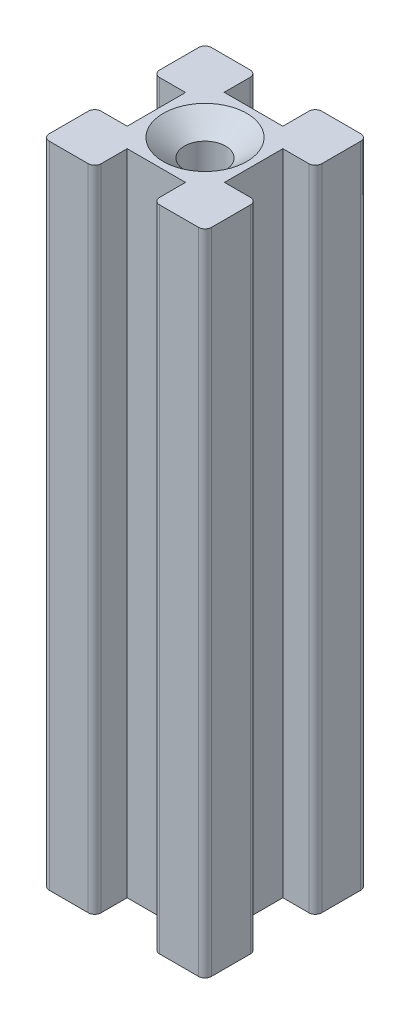
ISO-10303-21;
HEADER;
FILE_DESCRIPTION(('STEP AP214'),'2;1');
FILE_NAME('part.step','',(''),(''),'','','');
FILE_SCHEMA(('AUTOMOTIVE_DESIGN { 1 0 10303 214 1 1 1 1 }'));
ENDSEC;
DATA;
#1=APPLICATION_CONTEXT('core data for automotive mechanical design processes');
#2=APPLICATION_PROTOCOL_DEFINITION('international standard','automotive_design',2000,#1);
#3=PRODUCT_CONTEXT('',#1,'mechanical');
#4=PRODUCT('Part','Part','',(#3));
#5=PRODUCT_RELATED_PRODUCT_CATEGORY('part','',(#4));
#6=PRODUCT_DEFINITION_FORMATION('','',#4);
#7=PRODUCT_DEFINITION_CONTEXT('part definition',#1,'design');
#8=PRODUCT_DEFINITION('design','',#6,#7);
#9=PRODUCT_DEFINITION_SHAPE('','',#8);
#10=(LENGTH_UNIT() NAMED_UNIT(*) SI_UNIT(.MILLI.,.METRE.));
#11=(NAMED_UNIT(*) PLANE_ANGLE_UNIT() SI_UNIT($,.RADIAN.));
#12=(NAMED_UNIT(*) SI_UNIT($,.STERADIAN.) SOLID_ANGLE_UNIT());
#13=UNCERTAINTY_MEASURE_WITH_UNIT(LENGTH_MEASURE(1.E-05),#10,'distance_accuracy_value','');
#14=(GEOMETRIC_REPRESENTATION_CONTEXT(3) GLOBAL_UNCERTAINTY_ASSIGNED_CONTEXT((#13)) GLOBAL_UNIT_ASSIGNED_CONTEXT((#10,
#11,#12)) REPRESENTATION_CONTEXT('',''));
#15=CARTESIAN_POINT('',(0.,0.,0.));
#16=DIRECTION('',(0.,0.,1.));
#17=DIRECTION('',(1.,0.,0.));
#18=AXIS2_PLACEMENT_3D('',#15,#16,#17);
#19=CARTESIAN_POINT('',(0.,100.,0.));
#20=DIRECTION('',(0.,-1.,0.));
#21=DIRECTION('',(0.,0.,-1.));
#22=AXIS2_PLACEMENT_3D('',#19,#20,#21);
#23=PLANE('',#22);
#24=DIRECTION('',(-1.,0.,0.));
#25=VECTOR('',#24,1.);
#26=CARTESIAN_POINT('',(-12.5,100.,-12.5));
#27=LINE('',#26,#25);
#28=CARTESIAN_POINT('',(11.5,100.,-12.5));
#29=VERTEX_POINT('',#28);
#30=CARTESIAN_POINT('',(5.5,100.,-12.5));
#31=VERTEX_POINT('',#30);
#32=EDGE_CURVE('E349',#29,#31,#27,.T.);
#33=ORIENTED_EDGE('',*,*,#32,.T.);
#34=CARTESIAN_POINT('',(5.5,100.,-11.5));
#35=DIRECTION('',(0.,-1.,0.));
#36=DIRECTION('',(0.,0.,-1.));
#37=AXIS2_PLACEMENT_3D('',#34,#35,#36);
#38=CIRCLE('',#37,1.);
#39=CARTESIAN_POINT('',(4.5,100.,-11.5));
#40=VERTEX_POINT('',#39);
#41=EDGE_CURVE('E399',#31,#40,#38,.F.);
#42=ORIENTED_EDGE('',*,*,#41,.T.);
#43=DIRECTION('',(0.,0.,-1.));
#44=VECTOR('',#43,1.);
#45=CARTESIAN_POINT('',(4.5,100.,-12.5));
#46=LINE('',#45,#44);
#47=CARTESIAN_POINT('',(4.5,100.,-7.5));
#48=VERTEX_POINT('',#47);
#49=EDGE_CURVE('E282',#48,#40,#46,.T.);
#50=ORIENTED_EDGE('',*,*,#49,.F.);
#51=DIRECTION('',(1.,0.,0.));
#52=VECTOR('',#51,1.);
#53=CARTESIAN_POINT('',(-4.54888839386136,100.,-7.5));
#54=LINE('',#53,#52);
#55=CARTESIAN_POINT('',(-4.54888839386136,100.,-7.5));
#56=VERTEX_POINT('',#55);
#57=EDGE_CURVE('E290',#56,#48,#54,.T.);
#58=ORIENTED_EDGE('',*,*,#57,.F.);
#59=DIRECTION('',(0.,0.,1.));
#60=VECTOR('',#59,1.);
#61=CARTESIAN_POINT('',(-4.54888839386136,100.,-12.5));
#62=LINE('',#61,#60);
#63=CARTESIAN_POINT('',(-4.54888839386136,100.,-11.5));
#64=VERTEX_POINT('',#63);
#65=EDGE_CURVE('E288',#64,#56,#62,.T.);
#66=ORIENTED_EDGE('',*,*,#65,.F.);
#67=CARTESIAN_POINT('',(-5.54888839386136,100.,-11.5));
#68=DIRECTION('',(0.,-1.,0.));
#69=DIRECTION('',(0.,0.,-1.));
#70=AXIS2_PLACEMENT_3D('',#67,#68,#69);
#71=CIRCLE('',#70,1.);
#72=CARTESIAN_POINT('',(-5.54888839386136,100.,-12.5));
#73=VERTEX_POINT('',#72);
#74=EDGE_CURVE('E377',#64,#73,#71,.F.);
#75=ORIENTED_EDGE('',*,*,#74,.T.);
#76=CARTESIAN_POINT('',(-11.5,100.,-12.5));
#77=VERTEX_POINT('',#76);
#78=EDGE_CURVE('E346',#73,#77,#27,.T.);
#79=ORIENTED_EDGE('',*,*,#78,.T.);
#80=CARTESIAN_POINT('',(-11.5,100.,-11.5));
#81=DIRECTION('',(0.,-1.,0.));
#82=DIRECTION('',(0.,0.,-1.));
#83=AXIS2_PLACEMENT_3D('',#80,#81,#82);
#84=CIRCLE('',#83,1.);
#85=CARTESIAN_POINT('',(-12.5,100.,-11.5));
#86=VERTEX_POINT('',#85);
#87=EDGE_CURVE('E379',#77,#86,#84,.F.);
#88=ORIENTED_EDGE('',*,*,#87,.T.);
#89=DIRECTION('',(0.,0.,1.));
#90=VECTOR('',#89,1.);
#91=CARTESIAN_POINT('',(-12.5,100.,12.5));
#92=LINE('',#91,#90);
#93=CARTESIAN_POINT('',(-12.5,100.,-5.5));
#94=VERTEX_POINT('',#93);
#95=EDGE_CURVE('E353',#86,#94,#92,.T.);
#96=ORIENTED_EDGE('',*,*,#95,.T.);
#97=CARTESIAN_POINT('',(-11.5,100.,-5.5));
#98=DIRECTION('',(0.,-1.,0.));
#99=DIRECTION('',(0.,0.,-1.));
#100=AXIS2_PLACEMENT_3D('',#97,#98,#99);
#101=CIRCLE('',#100,1.);
#102=CARTESIAN_POINT('',(-11.5,100.,-4.5));
#103=VERTEX_POINT('',#102);
#104=EDGE_CURVE('E381',#94,#103,#101,.F.);
#105=ORIENTED_EDGE('',*,*,#104,.T.);
#106=DIRECTION('',(-1.,0.,0.));
#107=VECTOR('',#106,1.);
#108=CARTESIAN_POINT('',(-12.5,100.,-4.5));
#109=LINE('',#108,#107);
#110=CARTESIAN_POINT('',(-7.5,100.,-4.5));
#111=VERTEX_POINT('',#110);
#112=EDGE_CURVE('E269',#111,#103,#109,.T.);
#113=ORIENTED_EDGE('',*,*,#112,.F.);
#114=DIRECTION('',(0.,0.,-1.));
#115=VECTOR('',#114,1.);
#116=CARTESIAN_POINT('',(-7.5,100.,4.5));
#117=LINE('',#116,#115);
#118=CARTESIAN_POINT('',(-7.5,100.,4.5));
#119=VERTEX_POINT('',#118);
#120=EDGE_CURVE('E251',#119,#111,#117,.T.);
#121=ORIENTED_EDGE('',*,*,#120,.F.);
#122=DIRECTION('',(1.,0.,0.));
#123=VECTOR('',#122,1.);
#124=CARTESIAN_POINT('',(-12.5,100.,4.5));
#125=LINE('',#124,#123);
#126=CARTESIAN_POINT('',(-11.5,100.,4.5));
#127=VERTEX_POINT('',#126);
#128=EDGE_CURVE('E273',#127,#119,#125,.T.);
#129=ORIENTED_EDGE('',*,*,#128,.F.);
#130=CARTESIAN_POINT('',(-11.5,100.,5.5));
#131=DIRECTION('',(0.,-1.,0.));
#132=DIRECTION('',(0.,0.,-1.));
#133=AXIS2_PLACEMENT_3D('',#130,#131,#132);
#134=CIRCLE('',#133,1.);
#135=CARTESIAN_POINT('',(-12.5,100.,5.5));
#136=VERTEX_POINT('',#135);
#137=EDGE_CURVE('E383',#127,#136,#134,.F.);
#138=ORIENTED_EDGE('',*,*,#137,.T.);
#139=CARTESIAN_POINT('',(-12.5,100.,11.5));
#140=VERTEX_POINT('',#139);
#141=EDGE_CURVE('E350',#136,#140,#92,.T.);
#142=ORIENTED_EDGE('',*,*,#141,.T.);
#143=CARTESIAN_POINT('',(-11.5,100.,11.5));
#144=DIRECTION('',(0.,-1.,0.));
#145=DIRECTION('',(0.,0.,-1.));
#146=AXIS2_PLACEMENT_3D('',#143,#144,#145);
#147=CIRCLE('',#146,1.);
#148=CARTESIAN_POINT('',(-11.5,100.,12.5));
#149=VERTEX_POINT('',#148);
#150=EDGE_CURVE('E385',#140,#149,#147,.F.);
#151=ORIENTED_EDGE('',*,*,#150,.T.);
#152=DIRECTION('',(1.,0.,0.));
#153=VECTOR('',#152,1.);
#154=CARTESIAN_POINT('',(-12.5,100.,12.5));
#155=LINE('',#154,#153);
#156=CARTESIAN_POINT('',(-5.5,100.,12.5));
#157=VERTEX_POINT('',#156);
#158=EDGE_CURVE('E357',#149,#157,#155,.T.);
#159=ORIENTED_EDGE('',*,*,#158,.T.);
#160=CARTESIAN_POINT('',(-5.5,100.,11.5));
#161=DIRECTION('',(0.,-1.,0.));
#162=DIRECTION('',(0.,0.,-1.));
#163=AXIS2_PLACEMENT_3D('',#160,#161,#162);
#164=CIRCLE('',#163,1.);
#165=CARTESIAN_POINT('',(-4.5,100.,11.5));
#166=VERTEX_POINT('',#165);
#167=EDGE_CURVE('E387',#157,#166,#164,.F.);
#168=ORIENTED_EDGE('',*,*,#167,.T.);
#169=DIRECTION('',(0.,0.,1.));
#170=VECTOR('',#169,1.);
#171=CARTESIAN_POINT('',(-4.5,100.,12.5));
#172=LINE('',#171,#170);
#173=CARTESIAN_POINT('',(-4.5,100.,7.5));
#174=VERTEX_POINT('',#173);
#175=EDGE_CURVE('E309',#174,#166,#172,.T.);
#176=ORIENTED_EDGE('',*,*,#175,.F.);
#177=DIRECTION('',(-1.,0.,0.));
#178=VECTOR('',#177,1.);
#179=CARTESIAN_POINT('',(-4.5,100.,7.5));
#180=LINE('',#179,#178);
#181=CARTESIAN_POINT('',(4.5,100.,7.5));
#182=VERTEX_POINT('',#181);
#183=EDGE_CURVE('E303',#182,#174,#180,.T.);
#184=ORIENTED_EDGE('',*,*,#183,.F.);
#185=DIRECTION('',(0.,0.,-1.));
#186=VECTOR('',#185,1.);
#187=CARTESIAN_POINT('',(4.5,100.,12.5));
#188=LINE('',#187,#186);
#189=CARTESIAN_POINT('',(4.5,100.,11.5));
#190=VERTEX_POINT('',#189);
#191=EDGE_CURVE('E312',#190,#182,#188,.T.);
#192=ORIENTED_EDGE('',*,*,#191,.F.);
#193=CARTESIAN_POINT('',(5.5,100.,11.5));
#194=DIRECTION('',(0.,-1.,0.));
#195=DIRECTION('',(0.,0.,-1.));
#196=AXIS2_PLACEMENT_3D('',#193,#194,#195);
#197=CIRCLE('',#196,1.);
#198=CARTESIAN_POINT('',(5.5,100.,12.5));
#199=VERTEX_POINT('',#198);
#200=EDGE_CURVE('E389',#190,#199,#197,.F.);
#201=ORIENTED_EDGE('',*,*,#200,.T.);
#202=CARTESIAN_POINT('',(11.5,100.,12.5));
#203=VERTEX_POINT('',#202);
#204=EDGE_CURVE('E354',#199,#203,#155,.T.);
#205=ORIENTED_EDGE('',*,*,#204,.T.);
#206=CARTESIAN_POINT('',(11.5,100.,11.5));
#207=DIRECTION('',(0.,-1.,0.));
#208=DIRECTION('',(0.,0.,-1.));
#209=AXIS2_PLACEMENT_3D('',#206,#207,#208);
#210=CIRCLE('',#209,1.);
#211=CARTESIAN_POINT('',(12.5,100.,11.5));
#212=VERTEX_POINT('',#211);
#213=EDGE_CURVE('E391',#203,#212,#210,.F.);
#214=ORIENTED_EDGE('',*,*,#213,.T.);
#215=DIRECTION('',(0.,0.,-1.));
#216=VECTOR('',#215,1.);
#217=CARTESIAN_POINT('',(12.5,100.,12.5));
#218=LINE('',#217,#216);
#219=CARTESIAN_POINT('',(12.5,100.,5.5));
#220=VERTEX_POINT('',#219);
#221=EDGE_CURVE('E344',#212,#220,#218,.T.);
#222=ORIENTED_EDGE('',*,*,#221,.T.);
#223=CARTESIAN_POINT('',(11.5,100.,5.5));
#224=DIRECTION('',(0.,-1.,0.));
#225=DIRECTION('',(0.,0.,-1.));
#226=AXIS2_PLACEMENT_3D('',#223,#224,#225);
#227=CIRCLE('',#226,1.);
#228=CARTESIAN_POINT('',(11.5,100.,4.5));
#229=VERTEX_POINT('',#228);
#230=EDGE_CURVE('E393',#220,#229,#227,.F.);
#231=ORIENTED_EDGE('',*,*,#230,.T.);
#232=DIRECTION('',(1.,0.,0.));
#233=VECTOR('',#232,1.);
#234=CARTESIAN_POINT('',(12.5,100.,4.5));
#235=LINE('',#234,#233);
#236=CARTESIAN_POINT('',(7.5,100.,4.5));
#237=VERTEX_POINT('',#236);
#238=EDGE_CURVE('E323',#237,#229,#235,.T.);
#239=ORIENTED_EDGE('',*,*,#238,.F.);
#240=DIRECTION('',(0.,0.,1.));
#241=VECTOR('',#240,1.);
#242=CARTESIAN_POINT('',(7.5,100.,-4.5));
#243=LINE('',#242,#241);
#244=CARTESIAN_POINT('',(7.5,100.,-4.5));
#245=VERTEX_POINT('',#244);
#246=EDGE_CURVE('E332',#245,#237,#243,.T.);
#247=ORIENTED_EDGE('',*,*,#246,.F.);
#248=DIRECTION('',(-1.,0.,0.));
#249=VECTOR('',#248,1.);
#250=CARTESIAN_POINT('',(12.5,100.,-4.5));
#251=LINE('',#250,#249);
#252=CARTESIAN_POINT('',(11.5,100.,-4.5));
#253=VERTEX_POINT('',#252);
#254=EDGE_CURVE('E330',#253,#245,#251,.T.);
#255=ORIENTED_EDGE('',*,*,#254,.F.);
#256=CARTESIAN_POINT('',(11.5,100.,-5.5));
#257=DIRECTION('',(0.,-1.,0.));
#258=DIRECTION('',(0.,0.,-1.));
#259=AXIS2_PLACEMENT_3D('',#256,#257,#258);
#260=CIRCLE('',#259,1.);
#261=CARTESIAN_POINT('',(12.5,100.,-5.5));
#262=VERTEX_POINT('',#261);
#263=EDGE_CURVE('E395',#253,#262,#260,.F.);
#264=ORIENTED_EDGE('',*,*,#263,.T.);
#265=CARTESIAN_POINT('',(12.5,100.,-11.5));
#266=VERTEX_POINT('',#265);
#267=EDGE_CURVE('E341',#262,#266,#218,.T.);
#268=ORIENTED_EDGE('',*,*,#267,.T.);
#269=CARTESIAN_POINT('',(11.5,100.,-11.5));
#270=DIRECTION('',(0.,-1.,0.));
#271=DIRECTION('',(0.,0.,-1.));
#272=AXIS2_PLACEMENT_3D('',#269,#270,#271);
#273=CIRCLE('',#272,1.);
#274=EDGE_CURVE('E397',#266,#29,#273,.F.);
#275=ORIENTED_EDGE('',*,*,#274,.T.);
#276=EDGE_LOOP('',(#33,#42,#50,#58,#66,#75,#79,#88,#96,#105,#113,#121,#129,#138,#142,#151,#159,
#168,#176,#184,#192,#201,#205,#214,#222,#231,#239,#247,#255,#264,#268,#275));
#277=FACE_BOUND('',#276,.T.);
#278=CARTESIAN_POINT('',(0.,100.,0.));
#279=DIRECTION('',(0.,1.,0.));
#280=DIRECTION('',(0.,0.,1.));
#281=AXIS2_PLACEMENT_3D('',#278,#279,#280);
#282=CIRCLE('',#281,6.4389);
#283=CARTESIAN_POINT('',(0.,100.,6.4389));
#284=VERTEX_POINT('',#283);
#285=EDGE_CURVE('E895',#284,#284,#282,.T.);
#286=ORIENTED_EDGE('',*,*,#285,.F.);
#287=EDGE_LOOP('',(#286));
#288=FACE_BOUND('',#287,.T.);
#289=ADVANCED_FACE('F34',(#277,#288),#23,.F.);
#290=CARTESIAN_POINT('',(12.5,100.,12.5));
#291=DIRECTION('',(-1.,0.,0.));
#292=DIRECTION('',(0.,0.,1.));
#293=AXIS2_PLACEMENT_3D('',#290,#291,#292);
#294=PLANE('',#293);
#295=DIRECTION('',(0.,0.,-1.));
#296=VECTOR('',#295,1.);
#297=CARTESIAN_POINT('',(12.5,0.,12.5));
#298=LINE('',#297,#296);
#299=CARTESIAN_POINT('',(12.5,0.,11.5));
#300=VERTEX_POINT('',#299);
#301=CARTESIAN_POINT('',(12.5,0.,5.5));
#302=VERTEX_POINT('',#301);
#303=EDGE_CURVE('E358',#300,#302,#298,.T.);
#304=ORIENTED_EDGE('',*,*,#303,.T.);
#305=DIRECTION('',(0.,1.,0.));
#306=VECTOR('',#305,1.);
#307=CARTESIAN_POINT('',(12.5,100.,5.5));
#308=LINE('',#307,#306);
#309=EDGE_CURVE('E435',#302,#220,#308,.T.);
#310=ORIENTED_EDGE('',*,*,#309,.T.);
#311=ORIENTED_EDGE('',*,*,#221,.F.);
#312=DIRECTION('',(0.,-1.,0.));
#313=VECTOR('',#312,1.);
#314=CARTESIAN_POINT('',(12.5,100.,11.5));
#315=LINE('',#314,#313);
#316=EDGE_CURVE('E432',#212,#300,#315,.T.);
#317=ORIENTED_EDGE('',*,*,#316,.T.);
#318=EDGE_LOOP('',(#304,#310,#311,#317));
#319=FACE_BOUND('',#318,.T.);
#320=ADVANCED_FACE('F506',(#319),#294,.F.);
#321=CARTESIAN_POINT('',(-12.5,100.,-12.5));
#322=DIRECTION('',(0.,0.,1.));
#323=DIRECTION('',(1.,0.,0.));
#324=AXIS2_PLACEMENT_3D('',#321,#322,#323);
#325=PLANE('',#324);
#326=DIRECTION('',(-1.,0.,0.));
#327=VECTOR('',#326,1.);
#328=CARTESIAN_POINT('',(-12.5,0.,-12.5));
#329=LINE('',#328,#327);
#330=CARTESIAN_POINT('',(-5.54888839386136,0.,-12.5));
#331=VERTEX_POINT('',#330);
#332=CARTESIAN_POINT('',(-11.5,0.,-12.5));
#333=VERTEX_POINT('',#332);
#334=EDGE_CURVE('E361',#331,#333,#329,.T.);
#335=ORIENTED_EDGE('',*,*,#334,.T.);
#336=DIRECTION('',(0.,-1.,0.));
#337=VECTOR('',#336,1.);
#338=CARTESIAN_POINT('',(-11.5,100.,-12.5));
#339=LINE('',#338,#337);
#340=EDGE_CURVE('E42',#333,#77,#339,.F.);
#341=ORIENTED_EDGE('',*,*,#340,.T.);
#342=ORIENTED_EDGE('',*,*,#78,.F.);
#343=DIRECTION('',(0.,1.,0.));
#344=VECTOR('',#343,1.);
#345=CARTESIAN_POINT('',(-5.54888839386136,100.,-12.5));
#346=LINE('',#345,#344);
#347=EDGE_CURVE('E469',#73,#331,#346,.F.);
#348=ORIENTED_EDGE('',*,*,#347,.T.);
#349=EDGE_LOOP('',(#335,#341,#342,#348));
#350=FACE_BOUND('',#349,.T.);
#351=ADVANCED_FACE('F473',(#350),#325,.F.);
#352=CARTESIAN_POINT('',(-12.5,100.,12.5));
#353=DIRECTION('',(1.,0.,0.));
#354=DIRECTION('',(0.,0.,-1.));
#355=AXIS2_PLACEMENT_3D('',#352,#353,#354);
#356=PLANE('',#355);
#357=DIRECTION('',(0.,0.,1.));
#358=VECTOR('',#357,1.);
#359=CARTESIAN_POINT('',(-12.5,0.,12.5));
#360=LINE('',#359,#358);
#361=CARTESIAN_POINT('',(-12.5,0.,-11.5));
#362=VERTEX_POINT('',#361);
#363=CARTESIAN_POINT('',(-12.5,0.,-5.5));
#364=VERTEX_POINT('',#363);
#365=EDGE_CURVE('E367',#362,#364,#360,.T.);
#366=ORIENTED_EDGE('',*,*,#365,.T.);
#367=DIRECTION('',(0.,1.,0.));
#368=VECTOR('',#367,1.);
#369=CARTESIAN_POINT('',(-12.5,100.,-5.5));
#370=LINE('',#369,#368);
#371=EDGE_CURVE('E465',#364,#94,#370,.T.);
#372=ORIENTED_EDGE('',*,*,#371,.T.);
#373=ORIENTED_EDGE('',*,*,#95,.F.);
#374=DIRECTION('',(0.,-1.,0.));
#375=VECTOR('',#374,1.);
#376=CARTESIAN_POINT('',(-12.5,100.,-11.5));
#377=LINE('',#376,#375);
#378=EDGE_CURVE('E462',#86,#362,#377,.T.);
#379=ORIENTED_EDGE('',*,*,#378,.T.);
#380=EDGE_LOOP('',(#366,#372,#373,#379));
#381=FACE_BOUND('',#380,.T.);
#382=ADVANCED_FACE('F489',(#381),#356,.F.);
#383=CARTESIAN_POINT('',(-12.5,100.,12.5));
#384=DIRECTION('',(0.,0.,-1.));
#385=DIRECTION('',(-1.,0.,0.));
#386=AXIS2_PLACEMENT_3D('',#383,#384,#385);
#387=PLANE('',#386);
#388=DIRECTION('',(1.,0.,0.));
#389=VECTOR('',#388,1.);
#390=CARTESIAN_POINT('',(-12.5,0.,12.5));
#391=LINE('',#390,#389);
#392=CARTESIAN_POINT('',(-11.5,0.,12.5));
#393=VERTEX_POINT('',#392);
#394=CARTESIAN_POINT('',(-5.5,0.,12.5));
#395=VERTEX_POINT('',#394);
#396=EDGE_CURVE('E345',#393,#395,#391,.T.);
#397=ORIENTED_EDGE('',*,*,#396,.T.);
#398=DIRECTION('',(0.,1.,0.));
#399=VECTOR('',#398,1.);
#400=CARTESIAN_POINT('',(-5.5,100.,12.5));
#401=LINE('',#400,#399);
#402=EDGE_CURVE('E450',#395,#157,#401,.T.);
#403=ORIENTED_EDGE('',*,*,#402,.T.);
#404=ORIENTED_EDGE('',*,*,#158,.F.);
#405=DIRECTION('',(0.,-1.,0.));
#406=VECTOR('',#405,1.);
#407=CARTESIAN_POINT('',(-11.5,100.,12.5));
#408=LINE('',#407,#406);
#409=EDGE_CURVE('E447',#149,#393,#408,.T.);
#410=ORIENTED_EDGE('',*,*,#409,.T.);
#411=EDGE_LOOP('',(#397,#403,#404,#410));
#412=FACE_BOUND('',#411,.T.);
#413=ADVANCED_FACE('F591',(#412),#387,.F.);
#414=CARTESIAN_POINT('',(12.5,0.,-5.5));
#415=VERTEX_POINT('',#414);
#416=CARTESIAN_POINT('',(12.5,0.,-11.5));
#417=VERTEX_POINT('',#416);
#418=EDGE_CURVE('E255',#415,#417,#298,.T.);
#419=ORIENTED_EDGE('',*,*,#418,.T.);
#420=DIRECTION('',(0.,-1.,0.));
#421=VECTOR('',#420,1.);
#422=CARTESIAN_POINT('',(12.5,100.,-11.5));
#423=LINE('',#422,#421);
#424=EDGE_CURVE('E427',#417,#266,#423,.F.);
#425=ORIENTED_EDGE('',*,*,#424,.T.);
#426=ORIENTED_EDGE('',*,*,#267,.F.);
#427=DIRECTION('',(0.,1.,0.));
#428=VECTOR('',#427,1.);
#429=CARTESIAN_POINT('',(12.5,100.,-5.5));
#430=LINE('',#429,#428);
#431=EDGE_CURVE('E425',#262,#415,#430,.F.);
#432=ORIENTED_EDGE('',*,*,#431,.T.);
#433=EDGE_LOOP('',(#419,#425,#426,#432));
#434=FACE_BOUND('',#433,.T.);
#435=ADVANCED_FACE('F535',(#434),#294,.F.);
#436=CARTESIAN_POINT('',(11.5,0.,-12.5));
#437=VERTEX_POINT('',#436);
#438=CARTESIAN_POINT('',(5.5,0.,-12.5));
#439=VERTEX_POINT('',#438);
#440=EDGE_CURVE('E364',#437,#439,#329,.T.);
#441=ORIENTED_EDGE('',*,*,#440,.T.);
#442=DIRECTION('',(0.,1.,0.));
#443=VECTOR('',#442,1.);
#444=CARTESIAN_POINT('',(5.5,100.,-12.5));
#445=LINE('',#444,#443);
#446=EDGE_CURVE('E374',#439,#31,#445,.T.);
#447=ORIENTED_EDGE('',*,*,#446,.T.);
#448=ORIENTED_EDGE('',*,*,#32,.F.);
#449=DIRECTION('',(0.,-1.,0.));
#450=VECTOR('',#449,1.);
#451=CARTESIAN_POINT('',(11.5,100.,-12.5));
#452=LINE('',#451,#450);
#453=EDGE_CURVE('E371',#29,#437,#452,.T.);
#454=ORIENTED_EDGE('',*,*,#453,.T.);
#455=EDGE_LOOP('',(#441,#447,#448,#454));
#456=FACE_BOUND('',#455,.T.);
#457=ADVANCED_FACE('F545',(#456),#325,.F.);
#458=CARTESIAN_POINT('',(-12.5,0.,5.5));
#459=VERTEX_POINT('',#458);
#460=CARTESIAN_POINT('',(-12.5,0.,11.5));
#461=VERTEX_POINT('',#460);
#462=EDGE_CURVE('E365',#459,#461,#360,.T.);
#463=ORIENTED_EDGE('',*,*,#462,.T.);
#464=DIRECTION('',(0.,-1.,0.));
#465=VECTOR('',#464,1.);
#466=CARTESIAN_POINT('',(-12.5,100.,11.5));
#467=LINE('',#466,#465);
#468=EDGE_CURVE('E457',#461,#140,#467,.F.);
#469=ORIENTED_EDGE('',*,*,#468,.T.);
#470=ORIENTED_EDGE('',*,*,#141,.F.);
#471=DIRECTION('',(0.,1.,0.));
#472=VECTOR('',#471,1.);
#473=CARTESIAN_POINT('',(-12.5,100.,5.5));
#474=LINE('',#473,#472);
#475=EDGE_CURVE('E455',#136,#459,#474,.F.);
#476=ORIENTED_EDGE('',*,*,#475,.T.);
#477=EDGE_LOOP('',(#463,#469,#470,#476));
#478=FACE_BOUND('',#477,.T.);
#479=ADVANCED_FACE('F590',(#478),#356,.F.);
#480=CARTESIAN_POINT('',(5.5,0.,12.5));
#481=VERTEX_POINT('',#480);
#482=CARTESIAN_POINT('',(11.5,0.,12.5));
#483=VERTEX_POINT('',#482);
#484=EDGE_CURVE('E370',#481,#483,#391,.T.);
#485=ORIENTED_EDGE('',*,*,#484,.T.);
#486=DIRECTION('',(0.,-1.,0.));
#487=VECTOR('',#486,1.);
#488=CARTESIAN_POINT('',(11.5,100.,12.5));
#489=LINE('',#488,#487);
#490=EDGE_CURVE('E442',#483,#203,#489,.F.);
#491=ORIENTED_EDGE('',*,*,#490,.T.);
#492=ORIENTED_EDGE('',*,*,#204,.F.);
#493=DIRECTION('',(0.,1.,0.));
#494=VECTOR('',#493,1.);
#495=CARTESIAN_POINT('',(5.5,100.,12.5));
#496=LINE('',#495,#494);
#497=EDGE_CURVE('E440',#199,#481,#496,.F.);
#498=ORIENTED_EDGE('',*,*,#497,.T.);
#499=EDGE_LOOP('',(#485,#491,#492,#498));
#500=FACE_BOUND('',#499,.T.);
#501=ADVANCED_FACE('F495',(#500),#387,.F.);
#502=CARTESIAN_POINT('',(0.,0.,0.));
#503=DIRECTION('',(0.,-1.,0.));
#504=DIRECTION('',(0.,0.,-1.));
#505=AXIS2_PLACEMENT_3D('',#502,#503,#504);
#506=PLANE('',#505);
#507=CARTESIAN_POINT('',(0.,0.,0.));
#508=DIRECTION('',(0.,-1.,0.));
#509=DIRECTION('',(0.,0.,-1.));
#510=AXIS2_PLACEMENT_3D('',#507,#508,#509);
#511=CIRCLE('',#510,3.17499999999999);
#512=CARTESIAN_POINT('',(0.,0.,-3.17499999999999));
#513=VERTEX_POINT('',#512);
#514=EDGE_CURVE('E333',#513,#513,#511,.T.);
#515=ORIENTED_EDGE('',*,*,#514,.F.);
#516=EDGE_LOOP('',(#515));
#517=FACE_BOUND('',#516,.T.);
#518=DIRECTION('',(0.,0.,-1.));
#519=VECTOR('',#518,1.);
#520=CARTESIAN_POINT('',(4.5,0.,-12.5));
#521=LINE('',#520,#519);
#522=CARTESIAN_POINT('',(4.5,0.,-7.5));
#523=VERTEX_POINT('',#522);
#524=CARTESIAN_POINT('',(4.5,0.,-11.5));
#525=VERTEX_POINT('',#524);
#526=EDGE_CURVE('E285',#523,#525,#521,.T.);
#527=ORIENTED_EDGE('',*,*,#526,.T.);
#528=CARTESIAN_POINT('',(5.5,0.,-11.5));
#529=DIRECTION('',(0.,-1.,0.));
#530=DIRECTION('',(0.,0.,-1.));
#531=AXIS2_PLACEMENT_3D('',#528,#529,#530);
#532=CIRCLE('',#531,1.);
#533=EDGE_CURVE('E423',#525,#439,#532,.T.);
#534=ORIENTED_EDGE('',*,*,#533,.T.);
#535=ORIENTED_EDGE('',*,*,#440,.F.);
#536=CARTESIAN_POINT('',(11.5,0.,-11.5));
#537=DIRECTION('',(0.,-1.,0.));
#538=DIRECTION('',(0.,0.,-1.));
#539=AXIS2_PLACEMENT_3D('',#536,#537,#538);
#540=CIRCLE('',#539,1.);
#541=EDGE_CURVE('E421',#437,#417,#540,.T.);
#542=ORIENTED_EDGE('',*,*,#541,.T.);
#543=ORIENTED_EDGE('',*,*,#418,.F.);
#544=CARTESIAN_POINT('',(11.5,0.,-5.5));
#545=DIRECTION('',(0.,-1.,0.));
#546=DIRECTION('',(0.,0.,-1.));
#547=AXIS2_PLACEMENT_3D('',#544,#545,#546);
#548=CIRCLE('',#547,1.);
#549=CARTESIAN_POINT('',(11.5,0.,-4.5));
#550=VERTEX_POINT('',#549);
#551=EDGE_CURVE('E419',#415,#550,#548,.T.);
#552=ORIENTED_EDGE('',*,*,#551,.T.);
#553=DIRECTION('',(-1.,0.,0.));
#554=VECTOR('',#553,1.);
#555=CARTESIAN_POINT('',(12.5,0.,-4.5));
#556=LINE('',#555,#554);
#557=CARTESIAN_POINT('',(7.5,0.,-4.5));
#558=VERTEX_POINT('',#557);
#559=EDGE_CURVE('E320',#550,#558,#556,.T.);
#560=ORIENTED_EDGE('',*,*,#559,.T.);
#561=DIRECTION('',(0.,0.,1.));
#562=VECTOR('',#561,1.);
#563=CARTESIAN_POINT('',(7.5,0.,-4.5));
#564=LINE('',#563,#562);
#565=CARTESIAN_POINT('',(7.5,0.,4.5));
#566=VERTEX_POINT('',#565);
#567=EDGE_CURVE('E322',#558,#566,#564,.T.);
#568=ORIENTED_EDGE('',*,*,#567,.T.);
#569=DIRECTION('',(1.,0.,0.));
#570=VECTOR('',#569,1.);
#571=CARTESIAN_POINT('',(12.5,0.,4.5));
#572=LINE('',#571,#570);
#573=CARTESIAN_POINT('',(11.5,0.,4.5));
#574=VERTEX_POINT('',#573);
#575=EDGE_CURVE('E326',#566,#574,#572,.T.);
#576=ORIENTED_EDGE('',*,*,#575,.T.);
#577=CARTESIAN_POINT('',(11.5,0.,5.5));
#578=DIRECTION('',(0.,-1.,0.));
#579=DIRECTION('',(0.,0.,-1.));
#580=AXIS2_PLACEMENT_3D('',#577,#578,#579);
#581=CIRCLE('',#580,1.);
#582=EDGE_CURVE('E417',#574,#302,#581,.T.);
#583=ORIENTED_EDGE('',*,*,#582,.T.);
#584=ORIENTED_EDGE('',*,*,#303,.F.);
#585=CARTESIAN_POINT('',(11.5,0.,11.5));
#586=DIRECTION('',(0.,-1.,0.));
#587=DIRECTION('',(0.,0.,-1.));
#588=AXIS2_PLACEMENT_3D('',#585,#586,#587);
#589=CIRCLE('',#588,1.);
#590=EDGE_CURVE('E415',#300,#483,#589,.T.);
#591=ORIENTED_EDGE('',*,*,#590,.T.);
#592=ORIENTED_EDGE('',*,*,#484,.F.);
#593=CARTESIAN_POINT('',(5.5,0.,11.5));
#594=DIRECTION('',(0.,-1.,0.));
#595=DIRECTION('',(0.,0.,-1.));
#596=AXIS2_PLACEMENT_3D('',#593,#594,#595);
#597=CIRCLE('',#596,1.);
#598=CARTESIAN_POINT('',(4.5,0.,11.5));
#599=VERTEX_POINT('',#598);
#600=EDGE_CURVE('E413',#481,#599,#597,.T.);
#601=ORIENTED_EDGE('',*,*,#600,.T.);
#602=DIRECTION('',(0.,0.,-1.));
#603=VECTOR('',#602,1.);
#604=CARTESIAN_POINT('',(4.5,0.,12.5));
#605=LINE('',#604,#603);
#606=CARTESIAN_POINT('',(4.5,0.,7.5));
#607=VERTEX_POINT('',#606);
#608=EDGE_CURVE('E302',#599,#607,#605,.T.);
#609=ORIENTED_EDGE('',*,*,#608,.T.);
#610=DIRECTION('',(-1.,0.,0.));
#611=VECTOR('',#610,1.);
#612=CARTESIAN_POINT('',(-4.5,0.,7.5));
#613=LINE('',#612,#611);
#614=CARTESIAN_POINT('',(-4.5,0.,7.5));
#615=VERTEX_POINT('',#614);
#616=EDGE_CURVE('E305',#607,#615,#613,.T.);
#617=ORIENTED_EDGE('',*,*,#616,.T.);
#618=DIRECTION('',(0.,0.,1.));
#619=VECTOR('',#618,1.);
#620=CARTESIAN_POINT('',(-4.5,0.,12.5));
#621=LINE('',#620,#619);
#622=CARTESIAN_POINT('',(-4.5,0.,11.5));
#623=VERTEX_POINT('',#622);
#624=EDGE_CURVE('E299',#615,#623,#621,.T.);
#625=ORIENTED_EDGE('',*,*,#624,.T.);
#626=CARTESIAN_POINT('',(-5.5,0.,11.5));
#627=DIRECTION('',(0.,-1.,0.));
#628=DIRECTION('',(0.,0.,-1.));
#629=AXIS2_PLACEMENT_3D('',#626,#627,#628);
#630=CIRCLE('',#629,1.);
#631=EDGE_CURVE('E411',#623,#395,#630,.T.);
#632=ORIENTED_EDGE('',*,*,#631,.T.);
#633=ORIENTED_EDGE('',*,*,#396,.F.);
#634=CARTESIAN_POINT('',(-11.5,0.,11.5));
#635=DIRECTION('',(0.,-1.,0.));
#636=DIRECTION('',(0.,0.,-1.));
#637=AXIS2_PLACEMENT_3D('',#634,#635,#636);
#638=CIRCLE('',#637,1.);
#639=EDGE_CURVE('E55',#393,#461,#638,.T.);
#640=ORIENTED_EDGE('',*,*,#639,.T.);
#641=ORIENTED_EDGE('',*,*,#462,.F.);
#642=CARTESIAN_POINT('',(-11.5,0.,5.5));
#643=DIRECTION('',(0.,-1.,0.));
#644=DIRECTION('',(0.,0.,-1.));
#645=AXIS2_PLACEMENT_3D('',#642,#643,#644);
#646=CIRCLE('',#645,1.);
#647=CARTESIAN_POINT('',(-11.5,0.,4.5));
#648=VERTEX_POINT('',#647);
#649=EDGE_CURVE('E49',#459,#648,#646,.T.);
#650=ORIENTED_EDGE('',*,*,#649,.T.);
#651=DIRECTION('',(1.,0.,0.));
#652=VECTOR('',#651,1.);
#653=CARTESIAN_POINT('',(-12.5,0.,4.5));
#654=LINE('',#653,#652);
#655=CARTESIAN_POINT('',(-7.5,0.,4.5));
#656=VERTEX_POINT('',#655);
#657=EDGE_CURVE('E267',#648,#656,#654,.T.);
#658=ORIENTED_EDGE('',*,*,#657,.T.);
#659=DIRECTION('',(0.,0.,-1.));
#660=VECTOR('',#659,1.);
#661=CARTESIAN_POINT('',(-7.5,0.,4.5));
#662=LINE('',#661,#660);
#663=CARTESIAN_POINT('',(-7.5,0.,-4.5));
#664=VERTEX_POINT('',#663);
#665=EDGE_CURVE('E248',#656,#664,#662,.T.);
#666=ORIENTED_EDGE('',*,*,#665,.T.);
#667=DIRECTION('',(-1.,0.,0.));
#668=VECTOR('',#667,1.);
#669=CARTESIAN_POINT('',(-12.5,0.,-4.5));
#670=LINE('',#669,#668);
#671=CARTESIAN_POINT('',(-11.5,0.,-4.5));
#672=VERTEX_POINT('',#671);
#673=EDGE_CURVE('E259',#664,#672,#670,.T.);
#674=ORIENTED_EDGE('',*,*,#673,.T.);
#675=CARTESIAN_POINT('',(-11.5,0.,-5.5));
#676=DIRECTION('',(0.,-1.,0.));
#677=DIRECTION('',(0.,0.,-1.));
#678=AXIS2_PLACEMENT_3D('',#675,#676,#677);
#679=CIRCLE('',#678,1.);
#680=EDGE_CURVE('E407',#672,#364,#679,.T.);
#681=ORIENTED_EDGE('',*,*,#680,.T.);
#682=ORIENTED_EDGE('',*,*,#365,.F.);
#683=CARTESIAN_POINT('',(-11.5,0.,-11.5));
#684=DIRECTION('',(0.,-1.,0.));
#685=DIRECTION('',(0.,0.,-1.));
#686=AXIS2_PLACEMENT_3D('',#683,#684,#685);
#687=CIRCLE('',#686,1.);
#688=EDGE_CURVE('E405',#362,#333,#687,.T.);
#689=ORIENTED_EDGE('',*,*,#688,.T.);
#690=ORIENTED_EDGE('',*,*,#334,.F.);
#691=CARTESIAN_POINT('',(-5.54888839386136,0.,-11.5));
#692=DIRECTION('',(0.,-1.,0.));
#693=DIRECTION('',(0.,0.,-1.));
#694=AXIS2_PLACEMENT_3D('',#691,#692,#693);
#695=CIRCLE('',#694,1.);
#696=CARTESIAN_POINT('',(-4.54888839386136,0.,-11.5));
#697=VERTEX_POINT('',#696);
#698=EDGE_CURVE('E403',#331,#697,#695,.T.);
#699=ORIENTED_EDGE('',*,*,#698,.T.);
#700=DIRECTION('',(0.,0.,1.));
#701=VECTOR('',#700,1.);
#702=CARTESIAN_POINT('',(-4.54888839386136,0.,-12.5));
#703=LINE('',#702,#701);
#704=CARTESIAN_POINT('',(-4.54888839386136,0.,-7.5));
#705=VERTEX_POINT('',#704);
#706=EDGE_CURVE('E279',#697,#705,#703,.T.);
#707=ORIENTED_EDGE('',*,*,#706,.T.);
#708=DIRECTION('',(1.,0.,0.));
#709=VECTOR('',#708,1.);
#710=CARTESIAN_POINT('',(-4.54888839386136,0.,-7.5));
#711=LINE('',#710,#709);
#712=EDGE_CURVE('E281',#705,#523,#711,.T.);
#713=ORIENTED_EDGE('',*,*,#712,.T.);
#714=EDGE_LOOP('',(#527,#534,#535,#542,#543,#552,#560,#568,#576,#583,#584,#591,#592,#601,#609,
#617,#625,#632,#633,#640,#641,#650,#658,#666,#674,#681,#682,#689,#690,#699,#707,#713));
#715=FACE_BOUND('',#714,.T.);
#716=ADVANCED_FACE('F266',(#517,#715),#506,.T.);
#717=CARTESIAN_POINT('',(12.5,0.,4.5));
#718=DIRECTION('',(0.,0.,1.));
#719=DIRECTION('',(1.,0.,0.));
#720=AXIS2_PLACEMENT_3D('',#717,#718,#719);
#721=PLANE('',#720);
#722=ORIENTED_EDGE('',*,*,#238,.T.);
#723=DIRECTION('',(0.,1.,0.));
#724=VECTOR('',#723,1.);
#725=CARTESIAN_POINT('',(11.5,0.,4.5));
#726=LINE('',#725,#724);
#727=EDGE_CURVE('E438',#229,#574,#726,.F.);
#728=ORIENTED_EDGE('',*,*,#727,.T.);
#729=ORIENTED_EDGE('',*,*,#575,.F.);
#730=DIRECTION('',(0.,1.,0.));
#731=VECTOR('',#730,1.);
#732=CARTESIAN_POINT('',(7.5,0.,4.5));
#733=LINE('',#732,#731);
#734=EDGE_CURVE('E313',#566,#237,#733,.T.);
#735=ORIENTED_EDGE('',*,*,#734,.T.);
#736=EDGE_LOOP('',(#722,#728,#729,#735));
#737=FACE_BOUND('',#736,.T.);
#738=ADVANCED_FACE('F516',(#737),#721,.F.);
#739=CARTESIAN_POINT('',(7.5,0.,-4.5));
#740=DIRECTION('',(-1.,0.,0.));
#741=DIRECTION('',(0.,0.,1.));
#742=AXIS2_PLACEMENT_3D('',#739,#740,#741);
#743=PLANE('',#742);
#744=ORIENTED_EDGE('',*,*,#246,.T.);
#745=ORIENTED_EDGE('',*,*,#734,.F.);
#746=ORIENTED_EDGE('',*,*,#567,.F.);
#747=DIRECTION('',(0.,1.,0.));
#748=VECTOR('',#747,1.);
#749=CARTESIAN_POINT('',(7.5,0.,-4.5));
#750=LINE('',#749,#748);
#751=EDGE_CURVE('E329',#558,#245,#750,.T.);
#752=ORIENTED_EDGE('',*,*,#751,.T.);
#753=EDGE_LOOP('',(#744,#745,#746,#752));
#754=FACE_BOUND('',#753,.T.);
#755=ADVANCED_FACE('F520',(#754),#743,.F.);
#756=CARTESIAN_POINT('',(12.5,0.,-4.5));
#757=DIRECTION('',(0.,0.,-1.));
#758=DIRECTION('',(-1.,0.,0.));
#759=AXIS2_PLACEMENT_3D('',#756,#757,#758);
#760=PLANE('',#759);
#761=ORIENTED_EDGE('',*,*,#559,.F.);
#762=DIRECTION('',(0.,1.,0.));
#763=VECTOR('',#762,1.);
#764=CARTESIAN_POINT('',(11.5,0.,-4.5));
#765=LINE('',#764,#763);
#766=EDGE_CURVE('E429',#550,#253,#765,.T.);
#767=ORIENTED_EDGE('',*,*,#766,.T.);
#768=ORIENTED_EDGE('',*,*,#254,.T.);
#769=ORIENTED_EDGE('',*,*,#751,.F.);
#770=EDGE_LOOP('',(#761,#767,#768,#769));
#771=FACE_BOUND('',#770,.T.);
#772=ADVANCED_FACE('F526',(#771),#760,.F.);
#773=CARTESIAN_POINT('',(-4.5,0.,12.5));
#774=DIRECTION('',(-1.,0.,0.));
#775=DIRECTION('',(0.,0.,1.));
#776=AXIS2_PLACEMENT_3D('',#773,#774,#775);
#777=PLANE('',#776);
#778=ORIENTED_EDGE('',*,*,#175,.T.);
#779=DIRECTION('',(0.,1.,0.));
#780=VECTOR('',#779,1.);
#781=CARTESIAN_POINT('',(-4.5,0.,11.5));
#782=LINE('',#781,#780);
#783=EDGE_CURVE('E453',#166,#623,#782,.F.);
#784=ORIENTED_EDGE('',*,*,#783,.T.);
#785=ORIENTED_EDGE('',*,*,#624,.F.);
#786=DIRECTION('',(0.,1.,0.));
#787=VECTOR('',#786,1.);
#788=CARTESIAN_POINT('',(-4.5,0.,7.5));
#789=LINE('',#788,#787);
#790=EDGE_CURVE('E291',#615,#174,#789,.T.);
#791=ORIENTED_EDGE('',*,*,#790,.T.);
#792=EDGE_LOOP('',(#778,#784,#785,#791));
#793=FACE_BOUND('',#792,.T.);
#794=ADVANCED_FACE('F647',(#793),#777,.F.);
#795=CARTESIAN_POINT('',(-4.5,0.,7.5));
#796=DIRECTION('',(0.,0.,-1.));
#797=DIRECTION('',(-1.,0.,0.));
#798=AXIS2_PLACEMENT_3D('',#795,#796,#797);
#799=PLANE('',#798);
#800=ORIENTED_EDGE('',*,*,#183,.T.);
#801=ORIENTED_EDGE('',*,*,#790,.F.);
#802=ORIENTED_EDGE('',*,*,#616,.F.);
#803=DIRECTION('',(0.,1.,0.));
#804=VECTOR('',#803,1.);
#805=CARTESIAN_POINT('',(4.5,0.,7.5));
#806=LINE('',#805,#804);
#807=EDGE_CURVE('E308',#607,#182,#806,.T.);
#808=ORIENTED_EDGE('',*,*,#807,.T.);
#809=EDGE_LOOP('',(#800,#801,#802,#808));
#810=FACE_BOUND('',#809,.T.);
#811=ADVANCED_FACE('F650',(#810),#799,.F.);
#812=CARTESIAN_POINT('',(4.5,0.,12.5));
#813=DIRECTION('',(1.,0.,0.));
#814=DIRECTION('',(0.,0.,-1.));
#815=AXIS2_PLACEMENT_3D('',#812,#813,#814);
#816=PLANE('',#815);
#817=ORIENTED_EDGE('',*,*,#608,.F.);
#818=DIRECTION('',(0.,1.,0.));
#819=VECTOR('',#818,1.);
#820=CARTESIAN_POINT('',(4.5,0.,11.5));
#821=LINE('',#820,#819);
#822=EDGE_CURVE('E444',#599,#190,#821,.T.);
#823=ORIENTED_EDGE('',*,*,#822,.T.);
#824=ORIENTED_EDGE('',*,*,#191,.T.);
#825=ORIENTED_EDGE('',*,*,#807,.F.);
#826=EDGE_LOOP('',(#817,#823,#824,#825));
#827=FACE_BOUND('',#826,.T.);
#828=ADVANCED_FACE('F655',(#827),#816,.F.);
#829=CARTESIAN_POINT('',(-4.54888839386136,0.,-12.5));
#830=DIRECTION('',(-1.,0.,0.));
#831=DIRECTION('',(0.,0.,1.));
#832=AXIS2_PLACEMENT_3D('',#829,#830,#831);
#833=PLANE('',#832);
#834=ORIENTED_EDGE('',*,*,#706,.F.);
#835=DIRECTION('',(0.,1.,0.));
#836=VECTOR('',#835,1.);
#837=CARTESIAN_POINT('',(-4.54888839386136,0.,-11.5));
#838=LINE('',#837,#836);
#839=EDGE_CURVE('E11',#697,#64,#838,.T.);
#840=ORIENTED_EDGE('',*,*,#839,.T.);
#841=ORIENTED_EDGE('',*,*,#65,.T.);
#842=DIRECTION('',(0.,1.,0.));
#843=VECTOR('',#842,1.);
#844=CARTESIAN_POINT('',(-4.54888839386136,0.,-7.5));
#845=LINE('',#844,#843);
#846=EDGE_CURVE('E287',#705,#56,#845,.T.);
#847=ORIENTED_EDGE('',*,*,#846,.F.);
#848=EDGE_LOOP('',(#834,#840,#841,#847));
#849=FACE_BOUND('',#848,.T.);
#850=ADVANCED_FACE('F562',(#849),#833,.F.);
#851=CARTESIAN_POINT('',(4.5,0.,-12.5));
#852=DIRECTION('',(1.,0.,0.));
#853=DIRECTION('',(0.,0.,-1.));
#854=AXIS2_PLACEMENT_3D('',#851,#852,#853);
#855=PLANE('',#854);
#856=ORIENTED_EDGE('',*,*,#49,.T.);
#857=DIRECTION('',(0.,1.,0.));
#858=VECTOR('',#857,1.);
#859=CARTESIAN_POINT('',(4.5,0.,-11.5));
#860=LINE('',#859,#858);
#861=EDGE_CURVE('E401',#40,#525,#860,.F.);
#862=ORIENTED_EDGE('',*,*,#861,.T.);
#863=ORIENTED_EDGE('',*,*,#526,.F.);
#864=DIRECTION('',(0.,1.,0.));
#865=VECTOR('',#864,1.);
#866=CARTESIAN_POINT('',(4.5,0.,-7.5));
#867=LINE('',#866,#865);
#868=EDGE_CURVE('E275',#523,#48,#867,.T.);
#869=ORIENTED_EDGE('',*,*,#868,.T.);
#870=EDGE_LOOP('',(#856,#862,#863,#869));
#871=FACE_BOUND('',#870,.T.);
#872=ADVANCED_FACE('F552',(#871),#855,.F.);
#873=CARTESIAN_POINT('',(-4.54888839386136,0.,-7.5));
#874=DIRECTION('',(0.,0.,1.));
#875=DIRECTION('',(1.,0.,0.));
#876=AXIS2_PLACEMENT_3D('',#873,#874,#875);
#877=PLANE('',#876);
#878=ORIENTED_EDGE('',*,*,#57,.T.);
#879=ORIENTED_EDGE('',*,*,#868,.F.);
#880=ORIENTED_EDGE('',*,*,#712,.F.);
#881=ORIENTED_EDGE('',*,*,#846,.T.);
#882=EDGE_LOOP('',(#878,#879,#880,#881));
#883=FACE_BOUND('',#882,.T.);
#884=ADVANCED_FACE('F558',(#883),#877,.F.);
#885=CARTESIAN_POINT('',(-12.5,0.,-4.5));
#886=DIRECTION('',(0.,0.,-1.));
#887=DIRECTION('',(-1.,0.,0.));
#888=AXIS2_PLACEMENT_3D('',#885,#886,#887);
#889=PLANE('',#888);
#890=ORIENTED_EDGE('',*,*,#112,.T.);
#891=DIRECTION('',(0.,1.,0.));
#892=VECTOR('',#891,1.);
#893=CARTESIAN_POINT('',(-11.5,0.,-4.5));
#894=LINE('',#893,#892);
#895=EDGE_CURVE('E262',#103,#672,#894,.F.);
#896=ORIENTED_EDGE('',*,*,#895,.T.);
#897=ORIENTED_EDGE('',*,*,#673,.F.);
#898=DIRECTION('',(0.,1.,0.));
#899=VECTOR('',#898,1.);
#900=CARTESIAN_POINT('',(-7.5,0.,-4.5));
#901=LINE('',#900,#899);
#902=EDGE_CURVE('E243',#664,#111,#901,.T.);
#903=ORIENTED_EDGE('',*,*,#902,.T.);
#904=EDGE_LOOP('',(#890,#896,#897,#903));
#905=FACE_BOUND('',#904,.T.);
#906=ADVANCED_FACE('F260',(#905),#889,.F.);
#907=CARTESIAN_POINT('',(-7.5,0.,4.5));
#908=DIRECTION('',(1.,0.,0.));
#909=DIRECTION('',(0.,0.,-1.));
#910=AXIS2_PLACEMENT_3D('',#907,#908,#909);
#911=PLANE('',#910);
#912=ORIENTED_EDGE('',*,*,#120,.T.);
#913=ORIENTED_EDGE('',*,*,#902,.F.);
#914=ORIENTED_EDGE('',*,*,#665,.F.);
#915=DIRECTION('',(0.,1.,0.));
#916=VECTOR('',#915,1.);
#917=CARTESIAN_POINT('',(-7.5,0.,4.5));
#918=LINE('',#917,#916);
#919=EDGE_CURVE('E256',#656,#119,#918,.T.);
#920=ORIENTED_EDGE('',*,*,#919,.T.);
#921=EDGE_LOOP('',(#912,#913,#914,#920));
#922=FACE_BOUND('',#921,.T.);
#923=ADVANCED_FACE('F245',(#922),#911,.F.);
#924=CARTESIAN_POINT('',(-12.5,0.,4.5));
#925=DIRECTION('',(0.,0.,1.));
#926=DIRECTION('',(1.,0.,0.));
#927=AXIS2_PLACEMENT_3D('',#924,#925,#926);
#928=PLANE('',#927);
#929=ORIENTED_EDGE('',*,*,#657,.F.);
#930=DIRECTION('',(0.,1.,0.));
#931=VECTOR('',#930,1.);
#932=CARTESIAN_POINT('',(-11.5,0.,4.5));
#933=LINE('',#932,#931);
#934=EDGE_CURVE('E459',#648,#127,#933,.T.);
#935=ORIENTED_EDGE('',*,*,#934,.T.);
#936=ORIENTED_EDGE('',*,*,#128,.T.);
#937=ORIENTED_EDGE('',*,*,#919,.F.);
#938=EDGE_LOOP('',(#929,#935,#936,#937));
#939=FACE_BOUND('',#938,.T.);
#940=ADVANCED_FACE('F600',(#939),#928,.F.);
#941=CARTESIAN_POINT('',(5.5,100.,-11.5));
#942=DIRECTION('',(0.,1.,0.));
#943=DIRECTION('',(0.,0.,1.));
#944=AXIS2_PLACEMENT_3D('',#941,#942,#943);
#945=CYLINDRICAL_SURFACE('',#944,1.);
#946=ORIENTED_EDGE('',*,*,#533,.F.);
#947=ORIENTED_EDGE('',*,*,#861,.F.);
#948=ORIENTED_EDGE('',*,*,#41,.F.);
#949=ORIENTED_EDGE('',*,*,#446,.F.);
#950=EDGE_LOOP('',(#946,#947,#948,#949));
#951=FACE_BOUND('',#950,.T.);
#952=ADVANCED_FACE('F555',(#951),#945,.T.);
#953=CARTESIAN_POINT('',(11.5,100.,-11.5));
#954=DIRECTION('',(0.,-1.,0.));
#955=DIRECTION('',(0.,0.,-1.));
#956=AXIS2_PLACEMENT_3D('',#953,#954,#955);
#957=CYLINDRICAL_SURFACE('',#956,1.);
#958=ORIENTED_EDGE('',*,*,#274,.F.);
#959=ORIENTED_EDGE('',*,*,#424,.F.);
#960=ORIENTED_EDGE('',*,*,#541,.F.);
#961=ORIENTED_EDGE('',*,*,#453,.F.);
#962=EDGE_LOOP('',(#958,#959,#960,#961));
#963=FACE_BOUND('',#962,.T.);
#964=ADVANCED_FACE('F542',(#963),#957,.T.);
#965=CARTESIAN_POINT('',(11.5,0.,-5.5));
#966=DIRECTION('',(0.,1.,0.));
#967=DIRECTION('',(0.,0.,1.));
#968=AXIS2_PLACEMENT_3D('',#965,#966,#967);
#969=CYLINDRICAL_SURFACE('',#968,1.);
#970=ORIENTED_EDGE('',*,*,#551,.F.);
#971=ORIENTED_EDGE('',*,*,#431,.F.);
#972=ORIENTED_EDGE('',*,*,#263,.F.);
#973=ORIENTED_EDGE('',*,*,#766,.F.);
#974=EDGE_LOOP('',(#970,#971,#972,#973));
#975=FACE_BOUND('',#974,.T.);
#976=ADVANCED_FACE('F530',(#975),#969,.T.);
#977=CARTESIAN_POINT('',(11.5,100.,5.5));
#978=DIRECTION('',(0.,1.,0.));
#979=DIRECTION('',(0.,0.,1.));
#980=AXIS2_PLACEMENT_3D('',#977,#978,#979);
#981=CYLINDRICAL_SURFACE('',#980,1.);
#982=ORIENTED_EDGE('',*,*,#582,.F.);
#983=ORIENTED_EDGE('',*,*,#727,.F.);
#984=ORIENTED_EDGE('',*,*,#230,.F.);
#985=ORIENTED_EDGE('',*,*,#309,.F.);
#986=EDGE_LOOP('',(#982,#983,#984,#985));
#987=FACE_BOUND('',#986,.T.);
#988=ADVANCED_FACE('F511',(#987),#981,.T.);
#989=CARTESIAN_POINT('',(11.5,100.,11.5));
#990=DIRECTION('',(0.,-1.,0.));
#991=DIRECTION('',(0.,0.,-1.));
#992=AXIS2_PLACEMENT_3D('',#989,#990,#991);
#993=CYLINDRICAL_SURFACE('',#992,1.);
#994=ORIENTED_EDGE('',*,*,#213,.F.);
#995=ORIENTED_EDGE('',*,*,#490,.F.);
#996=ORIENTED_EDGE('',*,*,#590,.F.);
#997=ORIENTED_EDGE('',*,*,#316,.F.);
#998=EDGE_LOOP('',(#994,#995,#996,#997));
#999=FACE_BOUND('',#998,.T.);
#1000=ADVANCED_FACE('F501',(#999),#993,.T.);
#1001=CARTESIAN_POINT('',(5.5,0.,11.5));
#1002=DIRECTION('',(0.,1.,0.));
#1003=DIRECTION('',(0.,0.,1.));
#1004=AXIS2_PLACEMENT_3D('',#1001,#1002,#1003);
#1005=CYLINDRICAL_SURFACE('',#1004,1.);
#1006=ORIENTED_EDGE('',*,*,#600,.F.);
#1007=ORIENTED_EDGE('',*,*,#497,.F.);
#1008=ORIENTED_EDGE('',*,*,#200,.F.);
#1009=ORIENTED_EDGE('',*,*,#822,.F.);
#1010=EDGE_LOOP('',(#1006,#1007,#1008,#1009));
#1011=FACE_BOUND('',#1010,.T.);
#1012=ADVANCED_FACE('F609',(#1011),#1005,.T.);
#1013=CARTESIAN_POINT('',(-5.5,100.,11.5));
#1014=DIRECTION('',(0.,1.,0.));
#1015=DIRECTION('',(0.,0.,1.));
#1016=AXIS2_PLACEMENT_3D('',#1013,#1014,#1015);
#1017=CYLINDRICAL_SURFACE('',#1016,1.);
#1018=ORIENTED_EDGE('',*,*,#631,.F.);
#1019=ORIENTED_EDGE('',*,*,#783,.F.);
#1020=ORIENTED_EDGE('',*,*,#167,.F.);
#1021=ORIENTED_EDGE('',*,*,#402,.F.);
#1022=EDGE_LOOP('',(#1018,#1019,#1020,#1021));
#1023=FACE_BOUND('',#1022,.T.);
#1024=ADVANCED_FACE('F612',(#1023),#1017,.T.);
#1025=CARTESIAN_POINT('',(-11.5,100.,11.5));
#1026=DIRECTION('',(0.,-1.,0.));
#1027=DIRECTION('',(0.,0.,-1.));
#1028=AXIS2_PLACEMENT_3D('',#1025,#1026,#1027);
#1029=CYLINDRICAL_SURFACE('',#1028,1.);
#1030=ORIENTED_EDGE('',*,*,#150,.F.);
#1031=ORIENTED_EDGE('',*,*,#468,.F.);
#1032=ORIENTED_EDGE('',*,*,#639,.F.);
#1033=ORIENTED_EDGE('',*,*,#409,.F.);
#1034=EDGE_LOOP('',(#1030,#1031,#1032,#1033));
#1035=FACE_BOUND('',#1034,.T.);
#1036=ADVANCED_FACE('F616',(#1035),#1029,.T.);
#1037=CARTESIAN_POINT('',(-11.5,0.,5.5));
#1038=DIRECTION('',(0.,1.,0.));
#1039=DIRECTION('',(0.,0.,1.));
#1040=AXIS2_PLACEMENT_3D('',#1037,#1038,#1039);
#1041=CYLINDRICAL_SURFACE('',#1040,1.);
#1042=ORIENTED_EDGE('',*,*,#649,.F.);
#1043=ORIENTED_EDGE('',*,*,#475,.F.);
#1044=ORIENTED_EDGE('',*,*,#137,.F.);
#1045=ORIENTED_EDGE('',*,*,#934,.F.);
#1046=EDGE_LOOP('',(#1042,#1043,#1044,#1045));
#1047=FACE_BOUND('',#1046,.T.);
#1048=ADVANCED_FACE('F620',(#1047),#1041,.T.);
#1049=CARTESIAN_POINT('',(-11.5,100.,-5.5));
#1050=DIRECTION('',(0.,1.,0.));
#1051=DIRECTION('',(0.,0.,1.));
#1052=AXIS2_PLACEMENT_3D('',#1049,#1050,#1051);
#1053=CYLINDRICAL_SURFACE('',#1052,1.);
#1054=ORIENTED_EDGE('',*,*,#680,.F.);
#1055=ORIENTED_EDGE('',*,*,#895,.F.);
#1056=ORIENTED_EDGE('',*,*,#104,.F.);
#1057=ORIENTED_EDGE('',*,*,#371,.F.);
#1058=EDGE_LOOP('',(#1054,#1055,#1056,#1057));
#1059=FACE_BOUND('',#1058,.T.);
#1060=ADVANCED_FACE('F575',(#1059),#1053,.T.);
#1061=CARTESIAN_POINT('',(-11.5,100.,-11.5));
#1062=DIRECTION('',(0.,-1.,0.));
#1063=DIRECTION('',(0.,0.,-1.));
#1064=AXIS2_PLACEMENT_3D('',#1061,#1062,#1063);
#1065=CYLINDRICAL_SURFACE('',#1064,1.);
#1066=ORIENTED_EDGE('',*,*,#87,.F.);
#1067=ORIENTED_EDGE('',*,*,#340,.F.);
#1068=ORIENTED_EDGE('',*,*,#688,.F.);
#1069=ORIENTED_EDGE('',*,*,#378,.F.);
#1070=EDGE_LOOP('',(#1066,#1067,#1068,#1069));
#1071=FACE_BOUND('',#1070,.T.);
#1072=ADVANCED_FACE('F485',(#1071),#1065,.T.);
#1073=CARTESIAN_POINT('',(-5.54888839386136,0.,-11.5));
#1074=DIRECTION('',(0.,1.,0.));
#1075=DIRECTION('',(0.,0.,1.));
#1076=AXIS2_PLACEMENT_3D('',#1073,#1074,#1075);
#1077=CYLINDRICAL_SURFACE('',#1076,1.);
#1078=ORIENTED_EDGE('',*,*,#698,.F.);
#1079=ORIENTED_EDGE('',*,*,#347,.F.);
#1080=ORIENTED_EDGE('',*,*,#74,.F.);
#1081=ORIENTED_EDGE('',*,*,#839,.F.);
#1082=EDGE_LOOP('',(#1078,#1079,#1080,#1081));
#1083=FACE_BOUND('',#1082,.T.);
#1084=ADVANCED_FACE('F36',(#1083),#1077,.T.);
#1085=CARTESIAN_POINT('',(0.,100.,0.));
#1086=DIRECTION('',(0.,1.,0.));
#1087=DIRECTION('',(0.,0.,1.));
#1088=AXIS2_PLACEMENT_3D('',#1085,#1086,#1087);
#1089=CYLINDRICAL_SURFACE('',#1088,3.17499999999999);
#1090=CARTESIAN_POINT('',(0.,97.2612627138005,0.));
#1091=DIRECTION('',(0.,1.,0.));
#1092=DIRECTION('',(0.,0.,1.));
#1093=AXIS2_PLACEMENT_3D('',#1090,#1091,#1092);
#1094=CIRCLE('',#1093,3.175);
#1095=CARTESIAN_POINT('',(0.,97.2612627138005,3.175));
#1096=VERTEX_POINT('',#1095);
#1097=EDGE_CURVE('E892',#1096,#1096,#1094,.T.);
#1098=ORIENTED_EDGE('',*,*,#1097,.T.);
#1099=EDGE_LOOP('',(#1098));
#1100=FACE_BOUND('',#1099,.T.);
#1101=ORIENTED_EDGE('',*,*,#514,.T.);
#1102=EDGE_LOOP('',(#1101));
#1103=FACE_BOUND('',#1102,.T.);
#1104=ADVANCED_FACE('F567',(#1100,#1103),#1089,.F.);
#1105=CARTESIAN_POINT('',(0.,100.,0.));
#1106=DIRECTION('',(0.,1.,0.));
#1107=DIRECTION('',(0.,0.,1.));
#1108=AXIS2_PLACEMENT_3D('',#1105,#1106,#1107);
#1109=CONICAL_SURFACE('',#1108,6.4389,0.872664625997165);
#1110=ORIENTED_EDGE('',*,*,#1097,.F.);
#1111=EDGE_LOOP('',(#1110));
#1112=FACE_BOUND('',#1111,.T.);
#1113=ORIENTED_EDGE('',*,*,#285,.T.);
#1114=EDGE_LOOP('',(#1113));
#1115=FACE_BOUND('',#1114,.T.);
#1116=ADVANCED_FACE('F572',(#1112,#1115),#1109,.F.);
#1117=CLOSED_SHELL('',(#289,#320,#351,#382,#413,#435,#457,#479,#501,#716,#738,#755,#772,#794,
#811,#828,#850,#872,#884,#906,#923,#940,#952,#964,#976,#988,#1000,#1012,#1024,#1036,#1048,#1060,
#1072,#1084,#1104,#1116));
#1118=MANIFOLD_SOLID_BREP('B2',#1117);
#1119=ADVANCED_BREP_SHAPE_REPRESENTATION('',(#18,#1118),#14);
#1120=SHAPE_DEFINITION_REPRESENTATION(#9,#1119);
ENDSEC;
END-ISO-10303-21;
